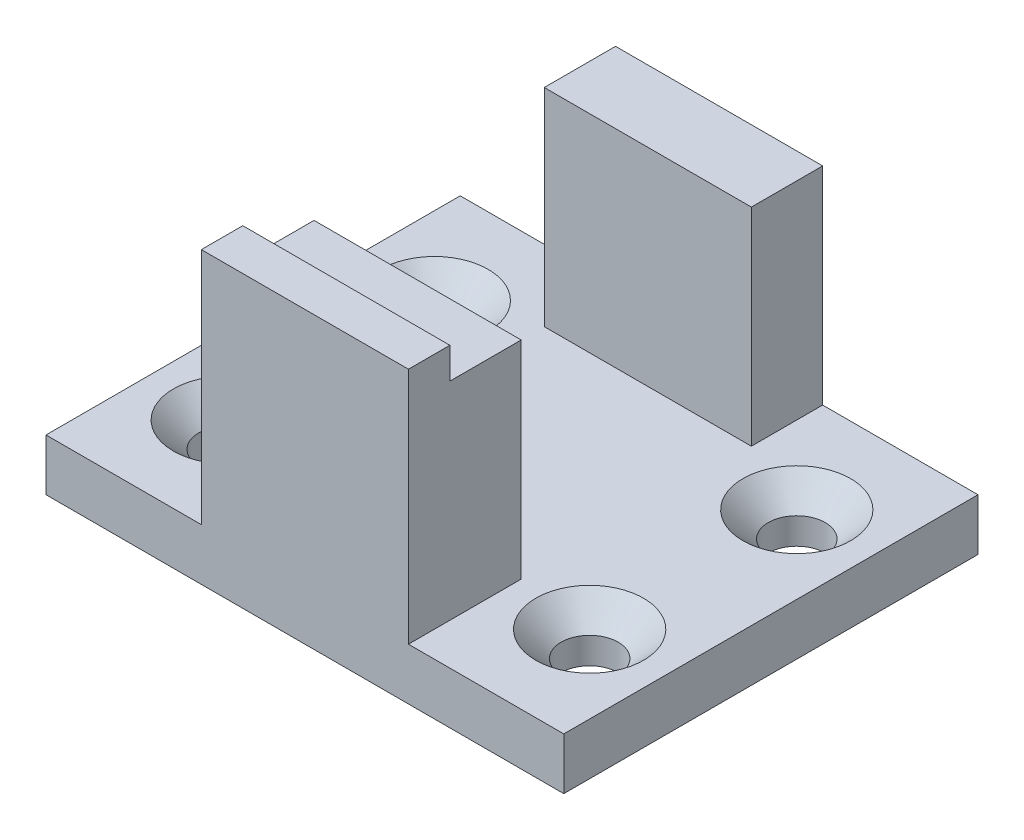
ISO-10303-21;
HEADER;
FILE_DESCRIPTION(('STEP AP214'),'2;1');
FILE_NAME('part.step','',(''),(''),'','','');
FILE_SCHEMA(('AUTOMOTIVE_DESIGN { 1 0 10303 214 1 1 1 1 }'));
ENDSEC;
DATA;
#1=APPLICATION_CONTEXT('core data for automotive mechanical design processes');
#2=APPLICATION_PROTOCOL_DEFINITION('international standard','automotive_design',2000,#1);
#3=PRODUCT_CONTEXT('',#1,'mechanical');
#4=PRODUCT('Part','Part','',(#3));
#5=PRODUCT_RELATED_PRODUCT_CATEGORY('part','',(#4));
#6=PRODUCT_DEFINITION_FORMATION('','',#4);
#7=PRODUCT_DEFINITION_CONTEXT('part definition',#1,'design');
#8=PRODUCT_DEFINITION('design','',#6,#7);
#9=PRODUCT_DEFINITION_SHAPE('','',#8);
#10=(LENGTH_UNIT() NAMED_UNIT(*) SI_UNIT(.MILLI.,.METRE.));
#11=(NAMED_UNIT(*) PLANE_ANGLE_UNIT() SI_UNIT($,.RADIAN.));
#12=(NAMED_UNIT(*) SI_UNIT($,.STERADIAN.) SOLID_ANGLE_UNIT());
#13=UNCERTAINTY_MEASURE_WITH_UNIT(LENGTH_MEASURE(1.E-05),#10,'distance_accuracy_value','');
#14=(GEOMETRIC_REPRESENTATION_CONTEXT(3) GLOBAL_UNCERTAINTY_ASSIGNED_CONTEXT((#13)) GLOBAL_UNIT_ASSIGNED_CONTEXT((#10,
#11,#12)) REPRESENTATION_CONTEXT('',''));
#15=CARTESIAN_POINT('',(0.,0.,0.));
#16=DIRECTION('',(0.,0.,1.));
#17=DIRECTION('',(1.,0.,0.));
#18=AXIS2_PLACEMENT_3D('',#15,#16,#17);
#19=CARTESIAN_POINT('',(20.,25.,0.));
#20=DIRECTION('',(-1.,0.,0.));
#21=DIRECTION('',(0.,0.,1.));
#22=AXIS2_PLACEMENT_3D('',#19,#20,#21);
#23=PLANE('',#22);
#24=DIRECTION('',(0.,-1.,0.));
#25=VECTOR('',#24,1.);
#26=CARTESIAN_POINT('',(20.,25.,40.));
#27=LINE('',#26,#25);
#28=CARTESIAN_POINT('',(20.,28.,40.));
#29=VERTEX_POINT('',#28);
#30=CARTESIAN_POINT('',(20.,5.,40.));
#31=VERTEX_POINT('',#30);
#32=EDGE_CURVE('E309',#29,#31,#27,.T.);
#33=ORIENTED_EDGE('',*,*,#32,.T.);
#34=DIRECTION('',(0.,0.,-1.));
#35=VECTOR('',#34,1.);
#36=CARTESIAN_POINT('',(20.,5.,0.));
#37=LINE('',#36,#35);
#38=CARTESIAN_POINT('',(20.,5.,29.115));
#39=VERTEX_POINT('',#38);
#40=EDGE_CURVE('E53',#31,#39,#37,.T.);
#41=ORIENTED_EDGE('',*,*,#40,.T.);
#42=DIRECTION('',(0.,1.,0.));
#43=VECTOR('',#42,1.);
#44=CARTESIAN_POINT('',(20.,0.,29.115));
#45=LINE('',#44,#43);
#46=CARTESIAN_POINT('',(20.,25.,29.115));
#47=VERTEX_POINT('',#46);
#48=EDGE_CURVE('E239',#39,#47,#45,.T.);
#49=ORIENTED_EDGE('',*,*,#48,.T.);
#50=DIRECTION('',(0.,0.,-1.));
#51=VECTOR('',#50,1.);
#52=CARTESIAN_POINT('',(20.,25.,0.));
#53=LINE('',#52,#51);
#54=CARTESIAN_POINT('',(20.,25.,36.));
#55=VERTEX_POINT('',#54);
#56=EDGE_CURVE('E294',#55,#47,#53,.T.);
#57=ORIENTED_EDGE('',*,*,#56,.F.);
#58=DIRECTION('',(0.,-1.,0.));
#59=VECTOR('',#58,1.);
#60=CARTESIAN_POINT('',(20.,28.,36.));
#61=LINE('',#60,#59);
#62=CARTESIAN_POINT('',(20.,28.,36.));
#63=VERTEX_POINT('',#62);
#64=EDGE_CURVE('E161',#63,#55,#61,.T.);
#65=ORIENTED_EDGE('',*,*,#64,.F.);
#66=DIRECTION('',(0.,0.,-1.));
#67=VECTOR('',#66,1.);
#68=CARTESIAN_POINT('',(20.,28.,40.));
#69=LINE('',#68,#67);
#70=EDGE_CURVE('E272',#29,#63,#69,.T.);
#71=ORIENTED_EDGE('',*,*,#70,.F.);
#72=EDGE_LOOP('',(#33,#41,#49,#57,#65,#71));
#73=FACE_BOUND('',#72,.T.);
#74=ADVANCED_FACE('F41',(#73),#23,.F.);
#75=CARTESIAN_POINT('',(0.,25.,0.));
#76=DIRECTION('',(1.,0.,0.));
#77=DIRECTION('',(0.,0.,-1.));
#78=AXIS2_PLACEMENT_3D('',#75,#76,#77);
#79=PLANE('',#78);
#80=DIRECTION('',(0.,0.,-1.));
#81=VECTOR('',#80,1.);
#82=CARTESIAN_POINT('',(0.,5.,0.));
#83=LINE('',#82,#81);
#84=CARTESIAN_POINT('',(0.,5.,40.));
#85=VERTEX_POINT('',#84);
#86=CARTESIAN_POINT('',(0.,5.00000000000001,29.115));
#87=VERTEX_POINT('',#86);
#88=EDGE_CURVE('E67',#85,#87,#83,.T.);
#89=ORIENTED_EDGE('',*,*,#88,.F.);
#90=DIRECTION('',(0.,-1.,0.));
#91=VECTOR('',#90,1.);
#92=CARTESIAN_POINT('',(0.,25.,40.));
#93=LINE('',#92,#91);
#94=CARTESIAN_POINT('',(0.,28.,40.));
#95=VERTEX_POINT('',#94);
#96=EDGE_CURVE('E45',#95,#85,#93,.T.);
#97=ORIENTED_EDGE('',*,*,#96,.F.);
#98=DIRECTION('',(0.,0.,1.));
#99=VECTOR('',#98,1.);
#100=CARTESIAN_POINT('',(0.,28.,40.));
#101=LINE('',#100,#99);
#102=CARTESIAN_POINT('',(0.,28.,36.));
#103=VERTEX_POINT('',#102);
#104=EDGE_CURVE('E264',#103,#95,#101,.T.);
#105=ORIENTED_EDGE('',*,*,#104,.F.);
#106=DIRECTION('',(0.,-1.,0.));
#107=VECTOR('',#106,1.);
#108=CARTESIAN_POINT('',(0.,28.,36.));
#109=LINE('',#108,#107);
#110=CARTESIAN_POINT('',(0.,25.,36.));
#111=VERTEX_POINT('',#110);
#112=EDGE_CURVE('E278',#103,#111,#109,.T.);
#113=ORIENTED_EDGE('',*,*,#112,.T.);
#114=DIRECTION('',(0.,0.,1.));
#115=VECTOR('',#114,1.);
#116=CARTESIAN_POINT('',(0.,25.,0.));
#117=LINE('',#116,#115);
#118=CARTESIAN_POINT('',(0.,25.,29.115));
#119=VERTEX_POINT('',#118);
#120=EDGE_CURVE('E293',#119,#111,#117,.T.);
#121=ORIENTED_EDGE('',*,*,#120,.F.);
#122=DIRECTION('',(0.,-1.,0.));
#123=VECTOR('',#122,1.);
#124=CARTESIAN_POINT('',(0.,0.,29.115));
#125=LINE('',#124,#123);
#126=EDGE_CURVE('E235',#119,#87,#125,.T.);
#127=ORIENTED_EDGE('',*,*,#126,.T.);
#128=EDGE_LOOP('',(#89,#97,#105,#113,#121,#127));
#129=FACE_BOUND('',#128,.T.);
#130=ADVANCED_FACE('F43',(#129),#79,.F.);
#131=CARTESIAN_POINT('',(0.,5.,6.885));
#132=VERTEX_POINT('',#131);
#133=CARTESIAN_POINT('',(0.,5.,0.));
#134=VERTEX_POINT('',#133);
#135=EDGE_CURVE('E51',#132,#134,#83,.T.);
#136=ORIENTED_EDGE('',*,*,#135,.F.);
#137=DIRECTION('',(0.,-1.,0.));
#138=VECTOR('',#137,1.);
#139=CARTESIAN_POINT('',(0.,0.,6.88500000000001));
#140=LINE('',#139,#138);
#141=CARTESIAN_POINT('',(0.,25.,6.885));
#142=VERTEX_POINT('',#141);
#143=EDGE_CURVE('E247',#142,#132,#140,.T.);
#144=ORIENTED_EDGE('',*,*,#143,.F.);
#145=CARTESIAN_POINT('',(0.,25.,0.));
#146=VERTEX_POINT('',#145);
#147=EDGE_CURVE('E288',#146,#142,#117,.T.);
#148=ORIENTED_EDGE('',*,*,#147,.F.);
#149=DIRECTION('',(0.,-1.,0.));
#150=VECTOR('',#149,1.);
#151=CARTESIAN_POINT('',(0.,25.,0.));
#152=LINE('',#151,#150);
#153=EDGE_CURVE('E300',#146,#134,#152,.T.);
#154=ORIENTED_EDGE('',*,*,#153,.T.);
#155=EDGE_LOOP('',(#136,#144,#148,#154));
#156=FACE_BOUND('',#155,.T.);
#157=ADVANCED_FACE('F399',(#156),#79,.F.);
#158=DIRECTION('',(0.,1.,0.));
#159=VECTOR('',#158,1.);
#160=CARTESIAN_POINT('',(20.,0.,6.885));
#161=LINE('',#160,#159);
#162=CARTESIAN_POINT('',(20.,5.,6.885));
#163=VERTEX_POINT('',#162);
#164=CARTESIAN_POINT('',(20.,25.,6.885));
#165=VERTEX_POINT('',#164);
#166=EDGE_CURVE('E236',#163,#165,#161,.T.);
#167=ORIENTED_EDGE('',*,*,#166,.F.);
#168=CARTESIAN_POINT('',(20.,5.,0.));
#169=VERTEX_POINT('',#168);
#170=EDGE_CURVE('E11',#163,#169,#37,.T.);
#171=ORIENTED_EDGE('',*,*,#170,.T.);
#172=DIRECTION('',(0.,-1.,0.));
#173=VECTOR('',#172,1.);
#174=CARTESIAN_POINT('',(20.,25.,0.));
#175=LINE('',#174,#173);
#176=CARTESIAN_POINT('',(20.,25.,0.));
#177=VERTEX_POINT('',#176);
#178=EDGE_CURVE('E306',#177,#169,#175,.T.);
#179=ORIENTED_EDGE('',*,*,#178,.F.);
#180=EDGE_CURVE('E292',#165,#177,#53,.T.);
#181=ORIENTED_EDGE('',*,*,#180,.F.);
#182=EDGE_LOOP('',(#167,#171,#179,#181));
#183=FACE_BOUND('',#182,.T.);
#184=ADVANCED_FACE('F395',(#183),#23,.F.);
#185=CARTESIAN_POINT('',(0.,25.,0.));
#186=DIRECTION('',(0.,1.,0.));
#187=DIRECTION('',(0.,0.,1.));
#188=AXIS2_PLACEMENT_3D('',#185,#186,#187);
#189=PLANE('',#188);
#190=ORIENTED_EDGE('',*,*,#56,.T.);
#191=DIRECTION('',(-1.,0.,0.));
#192=VECTOR('',#191,1.);
#193=CARTESIAN_POINT('',(49.9027239561883,25.,29.115));
#194=LINE('',#193,#192);
#195=EDGE_CURVE('E251',#47,#119,#194,.T.);
#196=ORIENTED_EDGE('',*,*,#195,.T.);
#197=ORIENTED_EDGE('',*,*,#120,.T.);
#198=DIRECTION('',(-1.,0.,0.));
#199=VECTOR('',#198,1.);
#200=CARTESIAN_POINT('',(0.,25.,36.));
#201=LINE('',#200,#199);
#202=EDGE_CURVE('E244',#55,#111,#201,.T.);
#203=ORIENTED_EDGE('',*,*,#202,.F.);
#204=EDGE_LOOP('',(#190,#196,#197,#203));
#205=FACE_BOUND('',#204,.T.);
#206=ADVANCED_FACE('F402',(#205),#189,.T.);
#207=CARTESIAN_POINT('',(0.,25.,40.));
#208=DIRECTION('',(0.,0.,-1.));
#209=DIRECTION('',(-1.,0.,0.));
#210=AXIS2_PLACEMENT_3D('',#207,#208,#209);
#211=PLANE('',#210);
#212=DIRECTION('',(1.,0.,0.));
#213=VECTOR('',#212,1.);
#214=CARTESIAN_POINT('',(0.,0.,40.));
#215=LINE('',#214,#213);
#216=CARTESIAN_POINT('',(-15.,0.,40.));
#217=VERTEX_POINT('',#216);
#218=CARTESIAN_POINT('',(35.,0.,40.));
#219=VERTEX_POINT('',#218);
#220=EDGE_CURVE('E146',#217,#219,#215,.T.);
#221=ORIENTED_EDGE('',*,*,#220,.T.);
#222=DIRECTION('',(0.,-1.,0.));
#223=VECTOR('',#222,1.);
#224=CARTESIAN_POINT('',(35.,47.7200187265877,40.));
#225=LINE('',#224,#223);
#226=CARTESIAN_POINT('',(35.,5.,40.));
#227=VERTEX_POINT('',#226);
#228=EDGE_CURVE('E150',#227,#219,#225,.T.);
#229=ORIENTED_EDGE('',*,*,#228,.F.);
#230=DIRECTION('',(-1.,0.,0.));
#231=VECTOR('',#230,1.);
#232=CARTESIAN_POINT('',(20.,5.,40.));
#233=LINE('',#232,#231);
#234=EDGE_CURVE('E170',#227,#31,#233,.T.);
#235=ORIENTED_EDGE('',*,*,#234,.T.);
#236=ORIENTED_EDGE('',*,*,#32,.F.);
#237=DIRECTION('',(1.,0.,0.));
#238=VECTOR('',#237,1.);
#239=CARTESIAN_POINT('',(0.,28.,40.));
#240=LINE('',#239,#238);
#241=EDGE_CURVE('E268',#95,#29,#240,.T.);
#242=ORIENTED_EDGE('',*,*,#241,.F.);
#243=ORIENTED_EDGE('',*,*,#96,.T.);
#244=DIRECTION('',(1.,0.,0.));
#245=VECTOR('',#244,1.);
#246=CARTESIAN_POINT('',(0.,5.,40.));
#247=LINE('',#246,#245);
#248=CARTESIAN_POINT('',(-15.,5.,40.));
#249=VERTEX_POINT('',#248);
#250=EDGE_CURVE('E213',#249,#85,#247,.T.);
#251=ORIENTED_EDGE('',*,*,#250,.F.);
#252=DIRECTION('',(0.,-1.,0.));
#253=VECTOR('',#252,1.);
#254=CARTESIAN_POINT('',(-15.,47.7200187265877,40.));
#255=LINE('',#254,#253);
#256=EDGE_CURVE('E154',#249,#217,#255,.T.);
#257=ORIENTED_EDGE('',*,*,#256,.T.);
#258=EDGE_LOOP('',(#221,#229,#235,#236,#242,#243,#251,#257));
#259=FACE_BOUND('',#258,.T.);
#260=ADVANCED_FACE('F148',(#259),#211,.F.);
#261=CARTESIAN_POINT('',(0.,25.,0.));
#262=DIRECTION('',(0.,0.,1.));
#263=DIRECTION('',(1.,0.,0.));
#264=AXIS2_PLACEMENT_3D('',#261,#262,#263);
#265=PLANE('',#264);
#266=DIRECTION('',(-1.,0.,0.));
#267=VECTOR('',#266,1.);
#268=CARTESIAN_POINT('',(0.,0.,0.));
#269=LINE('',#268,#267);
#270=CARTESIAN_POINT('',(35.,0.,0.));
#271=VERTEX_POINT('',#270);
#272=CARTESIAN_POINT('',(-15.,0.,0.));
#273=VERTEX_POINT('',#272);
#274=EDGE_CURVE('E160',#271,#273,#269,.T.);
#275=ORIENTED_EDGE('',*,*,#274,.T.);
#276=DIRECTION('',(0.,-1.,0.));
#277=VECTOR('',#276,1.);
#278=CARTESIAN_POINT('',(-15.,47.7200187265877,0.));
#279=LINE('',#278,#277);
#280=CARTESIAN_POINT('',(-15.,5.,0.));
#281=VERTEX_POINT('',#280);
#282=EDGE_CURVE('E218',#281,#273,#279,.T.);
#283=ORIENTED_EDGE('',*,*,#282,.F.);
#284=DIRECTION('',(1.,0.,0.));
#285=VECTOR('',#284,1.);
#286=CARTESIAN_POINT('',(0.,5.,0.));
#287=LINE('',#286,#285);
#288=EDGE_CURVE('E222',#281,#134,#287,.T.);
#289=ORIENTED_EDGE('',*,*,#288,.T.);
#290=ORIENTED_EDGE('',*,*,#153,.F.);
#291=DIRECTION('',(-1.,0.,0.));
#292=VECTOR('',#291,1.);
#293=CARTESIAN_POINT('',(0.,25.,0.));
#294=LINE('',#293,#292);
#295=EDGE_CURVE('E298',#177,#146,#294,.T.);
#296=ORIENTED_EDGE('',*,*,#295,.F.);
#297=ORIENTED_EDGE('',*,*,#178,.T.);
#298=DIRECTION('',(-1.,0.,0.));
#299=VECTOR('',#298,1.);
#300=CARTESIAN_POINT('',(20.,5.,0.));
#301=LINE('',#300,#299);
#302=CARTESIAN_POINT('',(35.,5.,0.));
#303=VERTEX_POINT('',#302);
#304=EDGE_CURVE('E60',#303,#169,#301,.T.);
#305=ORIENTED_EDGE('',*,*,#304,.F.);
#306=DIRECTION('',(0.,-1.,0.));
#307=VECTOR('',#306,1.);
#308=CARTESIAN_POINT('',(35.,47.7200187265877,0.));
#309=LINE('',#308,#307);
#310=EDGE_CURVE('E171',#303,#271,#309,.T.);
#311=ORIENTED_EDGE('',*,*,#310,.T.);
#312=EDGE_LOOP('',(#275,#283,#289,#290,#296,#297,#305,#311));
#313=FACE_BOUND('',#312,.T.);
#314=ADVANCED_FACE('F326',(#313),#265,.F.);
#315=DIRECTION('',(-1.,0.,0.));
#316=VECTOR('',#315,1.);
#317=CARTESIAN_POINT('',(49.9027239561883,25.,6.885));
#318=LINE('',#317,#316);
#319=EDGE_CURVE('E258',#165,#142,#318,.T.);
#320=ORIENTED_EDGE('',*,*,#319,.F.);
#321=ORIENTED_EDGE('',*,*,#180,.T.);
#322=ORIENTED_EDGE('',*,*,#295,.T.);
#323=ORIENTED_EDGE('',*,*,#147,.T.);
#324=EDGE_LOOP('',(#320,#321,#322,#323));
#325=FACE_BOUND('',#324,.T.);
#326=ADVANCED_FACE('F409',(#325),#189,.T.);
#327=CARTESIAN_POINT('',(0.,0.,0.));
#328=DIRECTION('',(0.,1.,0.));
#329=DIRECTION('',(0.,0.,1.));
#330=AXIS2_PLACEMENT_3D('',#327,#328,#329);
#331=PLANE('',#330);
#332=CARTESIAN_POINT('',(27.5,0.,10.));
#333=DIRECTION('',(0.,1.,0.));
#334=DIRECTION('',(0.,0.,1.));
#335=AXIS2_PLACEMENT_3D('',#332,#333,#334);
#336=CIRCLE('',#335,2.75);
#337=CARTESIAN_POINT('',(27.5,0.,12.75));
#338=VERTEX_POINT('',#337);
#339=EDGE_CURVE('E352',#338,#338,#336,.T.);
#340=ORIENTED_EDGE('',*,*,#339,.T.);
#341=EDGE_LOOP('',(#340));
#342=FACE_BOUND('',#341,.T.);
#343=CARTESIAN_POINT('',(27.5,0.,30.));
#344=DIRECTION('',(0.,1.,0.));
#345=DIRECTION('',(0.,0.,1.));
#346=AXIS2_PLACEMENT_3D('',#343,#344,#345);
#347=CIRCLE('',#346,2.75);
#348=CARTESIAN_POINT('',(27.5,0.,32.75));
#349=VERTEX_POINT('',#348);
#350=EDGE_CURVE('E176',#349,#349,#347,.T.);
#351=ORIENTED_EDGE('',*,*,#350,.T.);
#352=EDGE_LOOP('',(#351));
#353=FACE_BOUND('',#352,.T.);
#354=CARTESIAN_POINT('',(-7.5,0.,10.));
#355=DIRECTION('',(0.,1.,0.));
#356=DIRECTION('',(0.,0.,1.));
#357=AXIS2_PLACEMENT_3D('',#354,#355,#356);
#358=CIRCLE('',#357,2.75);
#359=CARTESIAN_POINT('',(-7.5,0.,12.75));
#360=VERTEX_POINT('',#359);
#361=EDGE_CURVE('E196',#360,#360,#358,.T.);
#362=ORIENTED_EDGE('',*,*,#361,.T.);
#363=EDGE_LOOP('',(#362));
#364=FACE_BOUND('',#363,.T.);
#365=CARTESIAN_POINT('',(-7.5,0.,30.));
#366=DIRECTION('',(0.,1.,0.));
#367=DIRECTION('',(0.,0.,1.));
#368=AXIS2_PLACEMENT_3D('',#365,#366,#367);
#369=CIRCLE('',#368,2.75);
#370=CARTESIAN_POINT('',(-7.5,0.,32.75));
#371=VERTEX_POINT('',#370);
#372=EDGE_CURVE('E208',#371,#371,#369,.T.);
#373=ORIENTED_EDGE('',*,*,#372,.T.);
#374=EDGE_LOOP('',(#373));
#375=FACE_BOUND('',#374,.T.);
#376=ORIENTED_EDGE('',*,*,#220,.F.);
#377=DIRECTION('',(0.,0.,1.));
#378=VECTOR('',#377,1.);
#379=CARTESIAN_POINT('',(-15.,0.,0.));
#380=LINE('',#379,#378);
#381=EDGE_CURVE('E212',#273,#217,#380,.T.);
#382=ORIENTED_EDGE('',*,*,#381,.F.);
#383=ORIENTED_EDGE('',*,*,#274,.F.);
#384=DIRECTION('',(0.,0.,1.));
#385=VECTOR('',#384,1.);
#386=CARTESIAN_POINT('',(35.,0.,0.));
#387=LINE('',#386,#385);
#388=EDGE_CURVE('E167',#271,#219,#387,.T.);
#389=ORIENTED_EDGE('',*,*,#388,.T.);
#390=EDGE_LOOP('',(#376,#382,#383,#389));
#391=FACE_BOUND('',#390,.T.);
#392=ADVANCED_FACE('F173',(#342,#353,#364,#375,#391),#331,.F.);
#393=CARTESIAN_POINT('',(0.,28.,36.));
#394=DIRECTION('',(0.,0.,1.));
#395=DIRECTION('',(1.,0.,0.));
#396=AXIS2_PLACEMENT_3D('',#393,#394,#395);
#397=PLANE('',#396);
#398=ORIENTED_EDGE('',*,*,#202,.T.);
#399=ORIENTED_EDGE('',*,*,#112,.F.);
#400=DIRECTION('',(-1.,0.,0.));
#401=VECTOR('',#400,1.);
#402=CARTESIAN_POINT('',(0.,28.,36.));
#403=LINE('',#402,#401);
#404=EDGE_CURVE('E275',#63,#103,#403,.T.);
#405=ORIENTED_EDGE('',*,*,#404,.F.);
#406=ORIENTED_EDGE('',*,*,#64,.T.);
#407=EDGE_LOOP('',(#398,#399,#405,#406));
#408=FACE_BOUND('',#407,.T.);
#409=ADVANCED_FACE('F421',(#408),#397,.F.);
#410=CARTESIAN_POINT('',(0.,28.,0.));
#411=DIRECTION('',(0.,-1.,0.));
#412=DIRECTION('',(0.,0.,-1.));
#413=AXIS2_PLACEMENT_3D('',#410,#411,#412);
#414=PLANE('',#413);
#415=ORIENTED_EDGE('',*,*,#104,.T.);
#416=ORIENTED_EDGE('',*,*,#241,.T.);
#417=ORIENTED_EDGE('',*,*,#70,.T.);
#418=ORIENTED_EDGE('',*,*,#404,.T.);
#419=EDGE_LOOP('',(#415,#416,#417,#418));
#420=FACE_BOUND('',#419,.T.);
#421=ADVANCED_FACE('F427',(#420),#414,.F.);
#422=CARTESIAN_POINT('',(49.9027239561883,0.,29.115));
#423=DIRECTION('',(0.,0.,-1.));
#424=DIRECTION('',(0.,1.,0.));
#425=AXIS2_PLACEMENT_3D('',#422,#423,#424);
#426=PLANE('',#425);
#427=DIRECTION('',(-1.,0.,0.));
#428=VECTOR('',#427,1.);
#429=CARTESIAN_POINT('',(49.9027239561883,5.00000000000001,29.115));
#430=LINE('',#429,#428);
#431=EDGE_CURVE('E240',#39,#87,#430,.T.);
#432=ORIENTED_EDGE('',*,*,#431,.T.);
#433=ORIENTED_EDGE('',*,*,#126,.F.);
#434=ORIENTED_EDGE('',*,*,#195,.F.);
#435=ORIENTED_EDGE('',*,*,#48,.F.);
#436=EDGE_LOOP('',(#432,#433,#434,#435));
#437=FACE_BOUND('',#436,.T.);
#438=ADVANCED_FACE('F333',(#437),#426,.T.);
#439=CARTESIAN_POINT('',(49.9027239561883,5.,0.));
#440=DIRECTION('',(0.,-1.,0.));
#441=DIRECTION('',(0.,0.,-1.));
#442=AXIS2_PLACEMENT_3D('',#439,#440,#441);
#443=PLANE('',#442);
#444=CARTESIAN_POINT('',(27.5,5.,10.));
#445=DIRECTION('',(0.,1.,0.));
#446=DIRECTION('',(0.,0.,1.));
#447=AXIS2_PLACEMENT_3D('',#444,#445,#446);
#448=CIRCLE('',#447,5.2);
#449=CARTESIAN_POINT('',(27.5,5.,15.2));
#450=VERTEX_POINT('',#449);
#451=EDGE_CURVE('E360',#450,#450,#448,.T.);
#452=ORIENTED_EDGE('',*,*,#451,.F.);
#453=EDGE_LOOP('',(#452));
#454=FACE_BOUND('',#453,.T.);
#455=CARTESIAN_POINT('',(27.5,5.00000000000001,30.));
#456=DIRECTION('',(0.,1.,0.));
#457=DIRECTION('',(0.,0.,1.));
#458=AXIS2_PLACEMENT_3D('',#455,#456,#457);
#459=CIRCLE('',#458,5.2);
#460=CARTESIAN_POINT('',(27.5,5.00000000000001,35.2));
#461=VERTEX_POINT('',#460);
#462=EDGE_CURVE('E348',#461,#461,#459,.T.);
#463=ORIENTED_EDGE('',*,*,#462,.F.);
#464=EDGE_LOOP('',(#463));
#465=FACE_BOUND('',#464,.T.);
#466=CARTESIAN_POINT('',(-7.5,5.,10.));
#467=DIRECTION('',(0.,1.,0.));
#468=DIRECTION('',(0.,0.,1.));
#469=AXIS2_PLACEMENT_3D('',#466,#467,#468);
#470=CIRCLE('',#469,5.2);
#471=CARTESIAN_POINT('',(-7.5,5.,15.2));
#472=VERTEX_POINT('',#471);
#473=EDGE_CURVE('E188',#472,#472,#470,.T.);
#474=ORIENTED_EDGE('',*,*,#473,.F.);
#475=EDGE_LOOP('',(#474));
#476=FACE_BOUND('',#475,.T.);
#477=CARTESIAN_POINT('',(-7.5,5.00000000000001,30.));
#478=DIRECTION('',(0.,1.,0.));
#479=DIRECTION('',(0.,0.,1.));
#480=AXIS2_PLACEMENT_3D('',#477,#478,#479);
#481=CIRCLE('',#480,5.2);
#482=CARTESIAN_POINT('',(-7.5,5.00000000000001,35.2));
#483=VERTEX_POINT('',#482);
#484=EDGE_CURVE('E200',#483,#483,#481,.T.);
#485=ORIENTED_EDGE('',*,*,#484,.F.);
#486=EDGE_LOOP('',(#485));
#487=FACE_BOUND('',#486,.T.);
#488=ORIENTED_EDGE('',*,*,#431,.F.);
#489=ORIENTED_EDGE('',*,*,#40,.F.);
#490=ORIENTED_EDGE('',*,*,#234,.F.);
#491=DIRECTION('',(0.,0.,-1.));
#492=VECTOR('',#491,1.);
#493=CARTESIAN_POINT('',(35.,5.,0.));
#494=LINE('',#493,#492);
#495=EDGE_CURVE('E168',#227,#303,#494,.T.);
#496=ORIENTED_EDGE('',*,*,#495,.T.);
#497=ORIENTED_EDGE('',*,*,#304,.T.);
#498=ORIENTED_EDGE('',*,*,#170,.F.);
#499=DIRECTION('',(-1.,0.,0.));
#500=VECTOR('',#499,1.);
#501=CARTESIAN_POINT('',(49.9027239561883,5.,6.885));
#502=LINE('',#501,#500);
#503=EDGE_CURVE('E254',#163,#132,#502,.T.);
#504=ORIENTED_EDGE('',*,*,#503,.T.);
#505=ORIENTED_EDGE('',*,*,#135,.T.);
#506=ORIENTED_EDGE('',*,*,#288,.F.);
#507=DIRECTION('',(0.,0.,-1.));
#508=VECTOR('',#507,1.);
#509=CARTESIAN_POINT('',(-15.,5.,0.));
#510=LINE('',#509,#508);
#511=EDGE_CURVE('E217',#249,#281,#510,.T.);
#512=ORIENTED_EDGE('',*,*,#511,.F.);
#513=ORIENTED_EDGE('',*,*,#250,.T.);
#514=ORIENTED_EDGE('',*,*,#88,.T.);
#515=EDGE_LOOP('',(#488,#489,#490,#496,#497,#498,#504,#505,#506,#512,#513,#514));
#516=FACE_BOUND('',#515,.T.);
#517=ADVANCED_FACE('F319',(#454,#465,#476,#487,#516),#443,.F.);
#518=CARTESIAN_POINT('',(49.9027239561883,0.,6.885));
#519=DIRECTION('',(0.,0.,-1.));
#520=DIRECTION('',(0.,1.,0.));
#521=AXIS2_PLACEMENT_3D('',#518,#519,#520);
#522=PLANE('',#521);
#523=ORIENTED_EDGE('',*,*,#166,.T.);
#524=ORIENTED_EDGE('',*,*,#319,.T.);
#525=ORIENTED_EDGE('',*,*,#143,.T.);
#526=ORIENTED_EDGE('',*,*,#503,.F.);
#527=EDGE_LOOP('',(#523,#524,#525,#526));
#528=FACE_BOUND('',#527,.T.);
#529=ADVANCED_FACE('F369',(#528),#522,.F.);
#530=CARTESIAN_POINT('',(-15.,47.7200187265877,0.));
#531=DIRECTION('',(1.,0.,0.));
#532=DIRECTION('',(0.,0.,-1.));
#533=AXIS2_PLACEMENT_3D('',#530,#531,#532);
#534=PLANE('',#533);
#535=ORIENTED_EDGE('',*,*,#256,.F.);
#536=ORIENTED_EDGE('',*,*,#511,.T.);
#537=ORIENTED_EDGE('',*,*,#282,.T.);
#538=ORIENTED_EDGE('',*,*,#381,.T.);
#539=EDGE_LOOP('',(#535,#536,#537,#538));
#540=FACE_BOUND('',#539,.T.);
#541=ADVANCED_FACE('F330',(#540),#534,.F.);
#542=CARTESIAN_POINT('',(-7.5,5.00000000000001,30.));
#543=DIRECTION('',(0.,1.,0.));
#544=DIRECTION('',(0.,0.,1.));
#545=AXIS2_PLACEMENT_3D('',#542,#543,#544);
#546=CYLINDRICAL_SURFACE('',#545,2.75);
#547=ORIENTED_EDGE('',*,*,#372,.F.);
#548=EDGE_LOOP('',(#547));
#549=FACE_BOUND('',#548,.T.);
#550=CARTESIAN_POINT('',(-7.5,2.55,30.));
#551=DIRECTION('',(0.,1.,0.));
#552=DIRECTION('',(0.,0.,1.));
#553=AXIS2_PLACEMENT_3D('',#550,#551,#552);
#554=CIRCLE('',#553,2.75);
#555=CARTESIAN_POINT('',(-7.5,2.55,32.75));
#556=VERTEX_POINT('',#555);
#557=EDGE_CURVE('E204',#556,#556,#554,.T.);
#558=ORIENTED_EDGE('',*,*,#557,.T.);
#559=EDGE_LOOP('',(#558));
#560=FACE_BOUND('',#559,.T.);
#561=ADVANCED_FACE('F380',(#549,#560),#546,.F.);
#562=CARTESIAN_POINT('',(-7.5,5.00000000000001,30.));
#563=DIRECTION('',(0.,1.,0.));
#564=DIRECTION('',(0.,0.,1.));
#565=AXIS2_PLACEMENT_3D('',#562,#563,#564);
#566=CONICAL_SURFACE('',#565,5.2,0.785398163397448);
#567=ORIENTED_EDGE('',*,*,#557,.F.);
#568=EDGE_LOOP('',(#567));
#569=FACE_BOUND('',#568,.T.);
#570=ORIENTED_EDGE('',*,*,#484,.T.);
#571=EDGE_LOOP('',(#570));
#572=FACE_BOUND('',#571,.T.);
#573=ADVANCED_FACE('F377',(#569,#572),#566,.F.);
#574=CARTESIAN_POINT('',(-7.5,5.,10.));
#575=DIRECTION('',(0.,1.,0.));
#576=DIRECTION('',(0.,0.,1.));
#577=AXIS2_PLACEMENT_3D('',#574,#575,#576);
#578=CYLINDRICAL_SURFACE('',#577,2.75);
#579=ORIENTED_EDGE('',*,*,#361,.F.);
#580=EDGE_LOOP('',(#579));
#581=FACE_BOUND('',#580,.T.);
#582=CARTESIAN_POINT('',(-7.5,2.55,10.));
#583=DIRECTION('',(0.,1.,0.));
#584=DIRECTION('',(0.,0.,1.));
#585=AXIS2_PLACEMENT_3D('',#582,#583,#584);
#586=CIRCLE('',#585,2.75);
#587=CARTESIAN_POINT('',(-7.5,2.55,12.75));
#588=VERTEX_POINT('',#587);
#589=EDGE_CURVE('E192',#588,#588,#586,.T.);
#590=ORIENTED_EDGE('',*,*,#589,.T.);
#591=EDGE_LOOP('',(#590));
#592=FACE_BOUND('',#591,.T.);
#593=ADVANCED_FACE('F379',(#581,#592),#578,.F.);
#594=CARTESIAN_POINT('',(-7.5,5.,10.));
#595=DIRECTION('',(0.,1.,0.));
#596=DIRECTION('',(0.,0.,1.));
#597=AXIS2_PLACEMENT_3D('',#594,#595,#596);
#598=CONICAL_SURFACE('',#597,5.2,0.785398163397448);
#599=ORIENTED_EDGE('',*,*,#589,.F.);
#600=EDGE_LOOP('',(#599));
#601=FACE_BOUND('',#600,.T.);
#602=ORIENTED_EDGE('',*,*,#473,.T.);
#603=EDGE_LOOP('',(#602));
#604=FACE_BOUND('',#603,.T.);
#605=ADVANCED_FACE('F387',(#601,#604),#598,.F.);
#606=CARTESIAN_POINT('',(35.,47.7200187265877,0.));
#607=DIRECTION('',(1.,0.,0.));
#608=DIRECTION('',(0.,0.,-1.));
#609=AXIS2_PLACEMENT_3D('',#606,#607,#608);
#610=PLANE('',#609);
#611=ORIENTED_EDGE('',*,*,#495,.F.);
#612=ORIENTED_EDGE('',*,*,#228,.T.);
#613=ORIENTED_EDGE('',*,*,#388,.F.);
#614=ORIENTED_EDGE('',*,*,#310,.F.);
#615=EDGE_LOOP('',(#611,#612,#613,#614));
#616=FACE_BOUND('',#615,.T.);
#617=ADVANCED_FACE('F165',(#616),#610,.T.);
#618=CARTESIAN_POINT('',(27.5,5.00000000000001,30.));
#619=DIRECTION('',(0.,1.,0.));
#620=DIRECTION('',(0.,0.,1.));
#621=AXIS2_PLACEMENT_3D('',#618,#619,#620);
#622=CYLINDRICAL_SURFACE('',#621,2.75);
#623=ORIENTED_EDGE('',*,*,#350,.F.);
#624=EDGE_LOOP('',(#623));
#625=FACE_BOUND('',#624,.T.);
#626=CARTESIAN_POINT('',(27.5,2.55,30.));
#627=DIRECTION('',(0.,1.,0.));
#628=DIRECTION('',(0.,0.,1.));
#629=AXIS2_PLACEMENT_3D('',#626,#627,#628);
#630=CIRCLE('',#629,2.75);
#631=CARTESIAN_POINT('',(27.5,2.55,32.75));
#632=VERTEX_POINT('',#631);
#633=EDGE_CURVE('E182',#632,#632,#630,.T.);
#634=ORIENTED_EDGE('',*,*,#633,.T.);
#635=EDGE_LOOP('',(#634));
#636=FACE_BOUND('',#635,.T.);
#637=ADVANCED_FACE('F525',(#625,#636),#622,.F.);
#638=CARTESIAN_POINT('',(27.5,5.00000000000001,30.));
#639=DIRECTION('',(0.,1.,0.));
#640=DIRECTION('',(0.,0.,1.));
#641=AXIS2_PLACEMENT_3D('',#638,#639,#640);
#642=CONICAL_SURFACE('',#641,5.2,0.785398163397448);
#643=ORIENTED_EDGE('',*,*,#633,.F.);
#644=EDGE_LOOP('',(#643));
#645=FACE_BOUND('',#644,.T.);
#646=ORIENTED_EDGE('',*,*,#462,.T.);
#647=EDGE_LOOP('',(#646));
#648=FACE_BOUND('',#647,.T.);
#649=ADVANCED_FACE('F534',(#645,#648),#642,.F.);
#650=CARTESIAN_POINT('',(27.5,5.,10.));
#651=DIRECTION('',(0.,1.,0.));
#652=DIRECTION('',(0.,0.,1.));
#653=AXIS2_PLACEMENT_3D('',#650,#651,#652);
#654=CYLINDRICAL_SURFACE('',#653,2.75);
#655=ORIENTED_EDGE('',*,*,#339,.F.);
#656=EDGE_LOOP('',(#655));
#657=FACE_BOUND('',#656,.T.);
#658=CARTESIAN_POINT('',(27.5,2.55,10.));
#659=DIRECTION('',(0.,1.,0.));
#660=DIRECTION('',(0.,0.,1.));
#661=AXIS2_PLACEMENT_3D('',#658,#659,#660);
#662=CIRCLE('',#661,2.75);
#663=CARTESIAN_POINT('',(27.5,2.55,12.75));
#664=VERTEX_POINT('',#663);
#665=EDGE_CURVE('E356',#664,#664,#662,.T.);
#666=ORIENTED_EDGE('',*,*,#665,.T.);
#667=EDGE_LOOP('',(#666));
#668=FACE_BOUND('',#667,.T.);
#669=ADVANCED_FACE('F544',(#657,#668),#654,.F.);
#670=CARTESIAN_POINT('',(27.5,5.,10.));
#671=DIRECTION('',(0.,1.,0.));
#672=DIRECTION('',(0.,0.,1.));
#673=AXIS2_PLACEMENT_3D('',#670,#671,#672);
#674=CONICAL_SURFACE('',#673,5.2,0.785398163397448);
#675=ORIENTED_EDGE('',*,*,#665,.F.);
#676=EDGE_LOOP('',(#675));
#677=FACE_BOUND('',#676,.T.);
#678=ORIENTED_EDGE('',*,*,#451,.T.);
#679=EDGE_LOOP('',(#678));
#680=FACE_BOUND('',#679,.T.);
#681=ADVANCED_FACE('F365',(#677,#680),#674,.F.);
#682=CLOSED_SHELL('',(#74,#130,#157,#184,#206,#260,#314,#326,#392,#409,#421,#438,#517,#529,#541,
#561,#573,#593,#605,#617,#637,#649,#669,#681));
#683=MANIFOLD_SOLID_BREP('B2',#682);
#684=ADVANCED_BREP_SHAPE_REPRESENTATION('',(#18,#683),#14);
#685=SHAPE_DEFINITION_REPRESENTATION(#9,#684);
ENDSEC;
END-ISO-10303-21;
